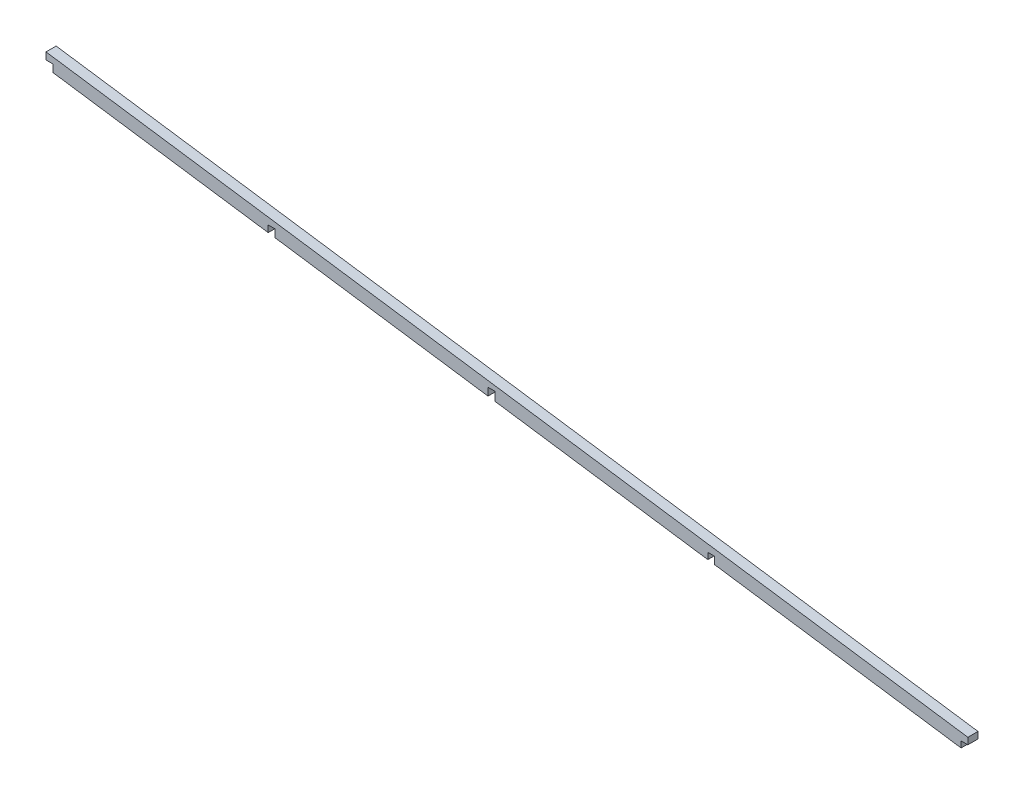
ISO-10303-21;
HEADER;
FILE_DESCRIPTION(('STEP AP214'),'2;1');
FILE_NAME('part.step','',(''),(''),'','','');
FILE_SCHEMA(('AUTOMOTIVE_DESIGN { 1 0 10303 214 1 1 1 1 }'));
ENDSEC;
DATA;
#1=APPLICATION_CONTEXT('core data for automotive mechanical design processes');
#2=APPLICATION_PROTOCOL_DEFINITION('international standard','automotive_design',2000,#1);
#3=PRODUCT_CONTEXT('',#1,'mechanical');
#4=PRODUCT('Part','Part','',(#3));
#5=PRODUCT_RELATED_PRODUCT_CATEGORY('part','',(#4));
#6=PRODUCT_DEFINITION_FORMATION('','',#4);
#7=PRODUCT_DEFINITION_CONTEXT('part definition',#1,'design');
#8=PRODUCT_DEFINITION('design','',#6,#7);
#9=PRODUCT_DEFINITION_SHAPE('','',#8);
#10=(LENGTH_UNIT() NAMED_UNIT(*) SI_UNIT(.MILLI.,.METRE.));
#11=(NAMED_UNIT(*) PLANE_ANGLE_UNIT() SI_UNIT($,.RADIAN.));
#12=(NAMED_UNIT(*) SI_UNIT($,.STERADIAN.) SOLID_ANGLE_UNIT());
#13=UNCERTAINTY_MEASURE_WITH_UNIT(LENGTH_MEASURE(1.E-05),#10,'distance_accuracy_value','');
#14=(GEOMETRIC_REPRESENTATION_CONTEXT(3) GLOBAL_UNCERTAINTY_ASSIGNED_CONTEXT((#13)) GLOBAL_UNIT_ASSIGNED_CONTEXT((#10,
#11,#12)) REPRESENTATION_CONTEXT('',''));
#15=CARTESIAN_POINT('',(0.,0.,0.));
#16=DIRECTION('',(0.,0.,1.));
#17=DIRECTION('',(1.,0.,0.));
#18=AXIS2_PLACEMENT_3D('',#15,#16,#17);
#19=CARTESIAN_POINT('',(23.0418348757126,10.8574587561782,3.));
#20=DIRECTION('',(0.999999999980888,6.18255264759213E-06,0.));
#21=DIRECTION('',(-6.18255264759213E-06,0.999999999980888,0.));
#22=AXIS2_PLACEMENT_3D('',#19,#20,#21);
#23=PLANE('',#22);
#24=DIRECTION('',(6.18255264759213E-06,-0.999999999980888,0.));
#25=VECTOR('',#24,1.);
#26=CARTESIAN_POINT('',(23.0418348757126,10.8574587561782,0.));
#27=LINE('',#26,#25);
#28=CARTESIAN_POINT('',(23.0418213046744,13.052512948605,0.));
#29=VERTEX_POINT('',#28);
#30=CARTESIAN_POINT('',(23.0418348757126,10.8574587561782,0.));
#31=VERTEX_POINT('',#30);
#32=EDGE_CURVE('E201',#29,#31,#27,.T.);
#33=ORIENTED_EDGE('',*,*,#32,.T.);
#34=DIRECTION('',(0.,0.,-1.));
#35=VECTOR('',#34,1.);
#36=CARTESIAN_POINT('',(23.0418348757126,10.8574587561782,3.));
#37=LINE('',#36,#35);
#38=CARTESIAN_POINT('',(23.0418348757126,10.8574587561782,3.));
#39=VERTEX_POINT('',#38);
#40=EDGE_CURVE('E11',#39,#31,#37,.T.);
#41=ORIENTED_EDGE('',*,*,#40,.F.);
#42=DIRECTION('',(6.18255264759213E-06,-0.999999999980888,0.));
#43=VECTOR('',#42,1.);
#44=CARTESIAN_POINT('',(23.0418348757126,10.8574587561782,3.));
#45=LINE('',#44,#43);
#46=CARTESIAN_POINT('',(23.0418213046744,13.052512948605,3.));
#47=VERTEX_POINT('',#46);
#48=EDGE_CURVE('E240',#47,#39,#45,.T.);
#49=ORIENTED_EDGE('',*,*,#48,.F.);
#50=DIRECTION('',(0.,0.,-1.));
#51=VECTOR('',#50,1.);
#52=CARTESIAN_POINT('',(23.0418213046744,13.052512948605,3.));
#53=LINE('',#52,#51);
#54=EDGE_CURVE('E197',#47,#29,#53,.T.);
#55=ORIENTED_EDGE('',*,*,#54,.T.);
#56=EDGE_LOOP('',(#33,#41,#49,#55));
#57=FACE_BOUND('',#56,.T.);
#58=ADVANCED_FACE('F33',(#57),#23,.F.);
#59=CARTESIAN_POINT('',(23.0418348757126,10.8574587561782,3.));
#60=DIRECTION('',(0.142626079954699,0.989776642135364,0.));
#61=DIRECTION('',(-0.989776642135364,0.142626079954699,0.));
#62=AXIS2_PLACEMENT_3D('',#59,#60,#61);
#63=PLANE('',#62);
#64=DIRECTION('',(0.989776642135364,-0.142626079954699,0.));
#65=VECTOR('',#64,1.);
#66=CARTESIAN_POINT('',(23.0418348757126,10.8574587561782,0.));
#67=LINE('',#66,#65);
#68=CARTESIAN_POINT('',(86.7418100605947,1.6783395821486,0.));
#69=VERTEX_POINT('',#68);
#70=EDGE_CURVE('E204',#31,#69,#67,.T.);
#71=ORIENTED_EDGE('',*,*,#70,.T.);
#72=DIRECTION('',(0.,0.,-1.));
#73=VECTOR('',#72,1.);
#74=CARTESIAN_POINT('',(86.7418100605947,1.6783395821486,3.));
#75=LINE('',#74,#73);
#76=CARTESIAN_POINT('',(86.7418100605947,1.6783395821486,3.));
#77=VERTEX_POINT('',#76);
#78=EDGE_CURVE('E41',#77,#69,#75,.T.);
#79=ORIENTED_EDGE('',*,*,#78,.F.);
#80=DIRECTION('',(0.989776642135364,-0.142626079954699,0.));
#81=VECTOR('',#80,1.);
#82=CARTESIAN_POINT('',(23.0418348757126,10.8574587561782,3.));
#83=LINE('',#82,#81);
#84=EDGE_CURVE('E128',#39,#77,#83,.T.);
#85=ORIENTED_EDGE('',*,*,#84,.F.);
#86=ORIENTED_EDGE('',*,*,#40,.T.);
#87=EDGE_LOOP('',(#71,#79,#85,#86));
#88=FACE_BOUND('',#87,.T.);
#89=ADVANCED_FACE('F358',(#88),#63,.F.);
#90=CARTESIAN_POINT('',(86.7418100605947,1.6783395821486,3.));
#91=DIRECTION('',(-1.,-1.26523713879882E-13,0.));
#92=DIRECTION('',(1.26523713879882E-13,-1.,0.));
#93=AXIS2_PLACEMENT_3D('',#90,#91,#92);
#94=PLANE('',#93);
#95=DIRECTION('',(-1.26523713879882E-13,1.,0.));
#96=VECTOR('',#95,1.);
#97=CARTESIAN_POINT('',(86.7418100605947,1.6783395821486,0.));
#98=LINE('',#97,#96);
#99=CARTESIAN_POINT('',(86.7418100605944,3.65267445488095,0.));
#100=VERTEX_POINT('',#99);
#101=EDGE_CURVE('E206',#69,#100,#98,.T.);
#102=ORIENTED_EDGE('',*,*,#101,.T.);
#103=DIRECTION('',(0.,0.,-1.));
#104=VECTOR('',#103,1.);
#105=CARTESIAN_POINT('',(86.7418100605944,3.65267445488095,3.));
#106=LINE('',#105,#104);
#107=CARTESIAN_POINT('',(86.7418100605944,3.65267445488095,3.));
#108=VERTEX_POINT('',#107);
#109=EDGE_CURVE('E283',#108,#100,#106,.T.);
#110=ORIENTED_EDGE('',*,*,#109,.F.);
#111=DIRECTION('',(-1.26523713879882E-13,1.,0.));
#112=VECTOR('',#111,1.);
#113=CARTESIAN_POINT('',(86.7418100605947,1.6783395821486,3.));
#114=LINE('',#113,#112);
#115=EDGE_CURVE('E291',#77,#108,#114,.T.);
#116=ORIENTED_EDGE('',*,*,#115,.F.);
#117=ORIENTED_EDGE('',*,*,#78,.T.);
#118=EDGE_LOOP('',(#102,#110,#116,#117));
#119=FACE_BOUND('',#118,.T.);
#120=ADVANCED_FACE('F289',(#119),#94,.F.);
#121=CARTESIAN_POINT('',(86.7418100605944,3.65267445488095,3.));
#122=DIRECTION('',(0.,1.,0.));
#123=DIRECTION('',(-1.,0.,0.));
#124=AXIS2_PLACEMENT_3D('',#121,#122,#123);
#125=PLANE('',#124);
#126=DIRECTION('',(1.,0.,0.));
#127=VECTOR('',#126,1.);
#128=CARTESIAN_POINT('',(86.7418100605944,3.65267445488095,0.));
#129=LINE('',#128,#127);
#130=CARTESIAN_POINT('',(88.741809775464,3.65267445488107,0.));
#131=VERTEX_POINT('',#130);
#132=EDGE_CURVE('E208',#100,#131,#129,.T.);
#133=ORIENTED_EDGE('',*,*,#132,.T.);
#134=DIRECTION('',(0.,0.,-1.));
#135=VECTOR('',#134,1.);
#136=CARTESIAN_POINT('',(88.741809775464,3.65267445488107,3.));
#137=LINE('',#136,#135);
#138=CARTESIAN_POINT('',(88.741809775464,3.65267445488107,3.));
#139=VERTEX_POINT('',#138);
#140=EDGE_CURVE('E280',#139,#131,#137,.T.);
#141=ORIENTED_EDGE('',*,*,#140,.F.);
#142=DIRECTION('',(1.,0.,0.));
#143=VECTOR('',#142,1.);
#144=CARTESIAN_POINT('',(86.7418100605944,3.65267445488095,3.));
#145=LINE('',#144,#143);
#146=EDGE_CURVE('E309',#108,#139,#145,.T.);
#147=ORIENTED_EDGE('',*,*,#146,.F.);
#148=ORIENTED_EDGE('',*,*,#109,.T.);
#149=EDGE_LOOP('',(#133,#141,#147,#148));
#150=FACE_BOUND('',#149,.T.);
#151=ADVANCED_FACE('F300',(#150),#125,.F.);
#152=CARTESIAN_POINT('',(88.741809775464,3.65267445488107,3.));
#153=DIRECTION('',(1.,0.,0.));
#154=DIRECTION('',(0.,1.,0.));
#155=AXIS2_PLACEMENT_3D('',#152,#153,#154);
#156=PLANE('',#155);
#157=DIRECTION('',(0.,-1.,0.));
#158=VECTOR('',#157,1.);
#159=CARTESIAN_POINT('',(88.741809775464,3.65267445488107,0.));
#160=LINE('',#159,#158);
#161=CARTESIAN_POINT('',(88.7418097754637,1.3901729309594,0.));
#162=VERTEX_POINT('',#161);
#163=EDGE_CURVE('E210',#131,#162,#160,.T.);
#164=ORIENTED_EDGE('',*,*,#163,.T.);
#165=DIRECTION('',(0.,0.,-1.));
#166=VECTOR('',#165,1.);
#167=CARTESIAN_POINT('',(88.7418097754637,1.3901729309594,3.));
#168=LINE('',#167,#166);
#169=CARTESIAN_POINT('',(88.7418097754637,1.3901729309594,3.));
#170=VERTEX_POINT('',#169);
#171=EDGE_CURVE('E277',#170,#162,#168,.T.);
#172=ORIENTED_EDGE('',*,*,#171,.F.);
#173=DIRECTION('',(0.,-1.,0.));
#174=VECTOR('',#173,1.);
#175=CARTESIAN_POINT('',(88.741809775464,3.65267445488107,3.));
#176=LINE('',#175,#174);
#177=EDGE_CURVE('E306',#139,#170,#176,.T.);
#178=ORIENTED_EDGE('',*,*,#177,.F.);
#179=ORIENTED_EDGE('',*,*,#140,.T.);
#180=EDGE_LOOP('',(#164,#172,#178,#179));
#181=FACE_BOUND('',#180,.T.);
#182=ADVANCED_FACE('F304',(#181),#156,.F.);
#183=CARTESIAN_POINT('',(88.7418097754637,1.3901729309594,3.));
#184=DIRECTION('',(0.142606134063426,0.989779516118355,0.));
#185=DIRECTION('',(-0.989779516118355,0.142606134063426,0.));
#186=AXIS2_PLACEMENT_3D('',#183,#184,#185);
#187=PLANE('',#186);
#188=DIRECTION('',(0.989779516118355,-0.142606134063426,0.));
#189=VECTOR('',#188,1.);
#190=CARTESIAN_POINT('',(88.7418097754637,1.3901729309594,0.));
#191=LINE('',#190,#189);
#192=CARTESIAN_POINT('',(151.741786892209,-7.68678111425753,0.));
#193=VERTEX_POINT('',#192);
#194=EDGE_CURVE('E212',#162,#193,#191,.T.);
#195=ORIENTED_EDGE('',*,*,#194,.T.);
#196=DIRECTION('',(0.,0.,-1.));
#197=VECTOR('',#196,1.);
#198=CARTESIAN_POINT('',(151.741786892209,-7.68678111425753,3.));
#199=LINE('',#198,#197);
#200=CARTESIAN_POINT('',(151.741786892209,-7.68678111425753,3.));
#201=VERTEX_POINT('',#200);
#202=EDGE_CURVE('E274',#201,#193,#199,.T.);
#203=ORIENTED_EDGE('',*,*,#202,.F.);
#204=DIRECTION('',(0.989779516118355,-0.142606134063426,0.));
#205=VECTOR('',#204,1.);
#206=CARTESIAN_POINT('',(88.7418097754637,1.3901729309594,3.));
#207=LINE('',#206,#205);
#208=EDGE_CURVE('E308',#170,#201,#207,.T.);
#209=ORIENTED_EDGE('',*,*,#208,.F.);
#210=ORIENTED_EDGE('',*,*,#171,.T.);
#211=EDGE_LOOP('',(#195,#203,#209,#210));
#212=FACE_BOUND('',#211,.T.);
#213=ADVANCED_FACE('F371',(#212),#187,.F.);
#214=CARTESIAN_POINT('',(151.741786892209,-7.68678111425753,3.));
#215=DIRECTION('',(-1.,0.,0.));
#216=DIRECTION('',(0.,-1.,0.));
#217=AXIS2_PLACEMENT_3D('',#214,#215,#216);
#218=PLANE('',#217);
#219=DIRECTION('',(0.,1.,0.));
#220=VECTOR('',#219,1.);
#221=CARTESIAN_POINT('',(151.741786892209,-7.68678111425753,0.));
#222=LINE('',#221,#220);
#223=CARTESIAN_POINT('',(151.741786892209,-5.41532554511885,0.));
#224=VERTEX_POINT('',#223);
#225=EDGE_CURVE('E214',#193,#224,#222,.T.);
#226=ORIENTED_EDGE('',*,*,#225,.T.);
#227=DIRECTION('',(0.,0.,-1.));
#228=VECTOR('',#227,1.);
#229=CARTESIAN_POINT('',(151.741786892209,-5.41532554511885,3.));
#230=LINE('',#229,#228);
#231=CARTESIAN_POINT('',(151.741786892209,-5.41532554511885,3.));
#232=VERTEX_POINT('',#231);
#233=EDGE_CURVE('E271',#232,#224,#230,.T.);
#234=ORIENTED_EDGE('',*,*,#233,.F.);
#235=DIRECTION('',(0.,1.,0.));
#236=VECTOR('',#235,1.);
#237=CARTESIAN_POINT('',(151.741786892209,-7.68678111425753,3.));
#238=LINE('',#237,#236);
#239=EDGE_CURVE('E311',#201,#232,#238,.T.);
#240=ORIENTED_EDGE('',*,*,#239,.F.);
#241=ORIENTED_EDGE('',*,*,#202,.T.);
#242=EDGE_LOOP('',(#226,#234,#240,#241));
#243=FACE_BOUND('',#242,.T.);
#244=ADVANCED_FACE('F374',(#243),#218,.F.);
#245=CARTESIAN_POINT('',(151.741786892209,-5.41532554511885,3.));
#246=DIRECTION('',(0.,1.,0.));
#247=DIRECTION('',(-1.,0.,0.));
#248=AXIS2_PLACEMENT_3D('',#245,#246,#247);
#249=PLANE('',#248);
#250=DIRECTION('',(1.,0.,0.));
#251=VECTOR('',#250,1.);
#252=CARTESIAN_POINT('',(151.741786892209,-5.41532554511885,0.));
#253=LINE('',#252,#251);
#254=CARTESIAN_POINT('',(153.741786607054,-5.41532554511891,0.));
#255=VERTEX_POINT('',#254);
#256=EDGE_CURVE('E216',#224,#255,#253,.T.);
#257=ORIENTED_EDGE('',*,*,#256,.T.);
#258=DIRECTION('',(0.,0.,-1.));
#259=VECTOR('',#258,1.);
#260=CARTESIAN_POINT('',(153.741786607054,-5.41532554511891,3.));
#261=LINE('',#260,#259);
#262=CARTESIAN_POINT('',(153.741786607054,-5.41532554511891,3.));
#263=VERTEX_POINT('',#262);
#264=EDGE_CURVE('E268',#263,#255,#261,.T.);
#265=ORIENTED_EDGE('',*,*,#264,.F.);
#266=DIRECTION('',(1.,0.,0.));
#267=VECTOR('',#266,1.);
#268=CARTESIAN_POINT('',(151.741786892209,-5.41532554511885,3.));
#269=LINE('',#268,#267);
#270=EDGE_CURVE('E317',#232,#263,#269,.T.);
#271=ORIENTED_EDGE('',*,*,#270,.F.);
#272=ORIENTED_EDGE('',*,*,#233,.T.);
#273=EDGE_LOOP('',(#257,#265,#271,#272));
#274=FACE_BOUND('',#273,.T.);
#275=ADVANCED_FACE('F378',(#274),#249,.F.);
#276=CARTESIAN_POINT('',(153.741786607054,-5.41532554511891,3.));
#277=DIRECTION('',(1.,0.,0.));
#278=DIRECTION('',(0.,1.,0.));
#279=AXIS2_PLACEMENT_3D('',#276,#277,#278);
#280=PLANE('',#279);
#281=DIRECTION('',(0.,-1.,0.));
#282=VECTOR('',#281,1.);
#283=CARTESIAN_POINT('',(153.741786607054,-5.41532554511891,0.));
#284=LINE('',#283,#282);
#285=CARTESIAN_POINT('',(153.741786607054,-7.97494014156868,0.));
#286=VERTEX_POINT('',#285);
#287=EDGE_CURVE('E218',#255,#286,#284,.T.);
#288=ORIENTED_EDGE('',*,*,#287,.T.);
#289=DIRECTION('',(0.,0.,-1.));
#290=VECTOR('',#289,1.);
#291=CARTESIAN_POINT('',(153.741786607054,-7.97494014156868,3.));
#292=LINE('',#291,#290);
#293=CARTESIAN_POINT('',(153.741786607054,-7.97494014156868,3.));
#294=VERTEX_POINT('',#293);
#295=EDGE_CURVE('E265',#294,#286,#292,.T.);
#296=ORIENTED_EDGE('',*,*,#295,.F.);
#297=DIRECTION('',(0.,-1.,0.));
#298=VECTOR('',#297,1.);
#299=CARTESIAN_POINT('',(153.741786607054,-5.41532554511891,3.));
#300=LINE('',#299,#298);
#301=EDGE_CURVE('E319',#263,#294,#300,.T.);
#302=ORIENTED_EDGE('',*,*,#301,.F.);
#303=ORIENTED_EDGE('',*,*,#264,.T.);
#304=EDGE_LOOP('',(#288,#296,#302,#303));
#305=FACE_BOUND('',#304,.T.);
#306=ADVANCED_FACE('F382',(#305),#280,.F.);
#307=CARTESIAN_POINT('',(153.741786607054,-7.97494014156868,3.));
#308=DIRECTION('',(0.14260917570359,0.98977907787806,0.));
#309=DIRECTION('',(-0.98977907787806,0.14260917570359,0.));
#310=AXIS2_PLACEMENT_3D('',#307,#308,#309);
#311=PLANE('',#310);
#312=DIRECTION('',(0.98977907787806,-0.14260917570359,0.));
#313=VECTOR('',#312,1.);
#314=CARTESIAN_POINT('',(153.741786607054,-7.97494014156868,0.));
#315=LINE('',#314,#313);
#316=CARTESIAN_POINT('',(216.741763723401,-17.052091807745,0.));
#317=VERTEX_POINT('',#316);
#318=EDGE_CURVE('E220',#286,#317,#315,.T.);
#319=ORIENTED_EDGE('',*,*,#318,.T.);
#320=DIRECTION('',(0.,0.,-1.));
#321=VECTOR('',#320,1.);
#322=CARTESIAN_POINT('',(216.741763723401,-17.052091807745,3.));
#323=LINE('',#322,#321);
#324=CARTESIAN_POINT('',(216.741763723401,-17.052091807745,3.));
#325=VERTEX_POINT('',#324);
#326=EDGE_CURVE('E262',#325,#317,#323,.T.);
#327=ORIENTED_EDGE('',*,*,#326,.F.);
#328=DIRECTION('',(0.98977907787806,-0.14260917570359,0.));
#329=VECTOR('',#328,1.);
#330=CARTESIAN_POINT('',(153.741786607054,-7.97494014156868,3.));
#331=LINE('',#330,#329);
#332=EDGE_CURVE('E321',#294,#325,#331,.T.);
#333=ORIENTED_EDGE('',*,*,#332,.F.);
#334=ORIENTED_EDGE('',*,*,#295,.T.);
#335=EDGE_LOOP('',(#319,#327,#333,#334));
#336=FACE_BOUND('',#335,.T.);
#337=ADVANCED_FACE('F386',(#336),#311,.F.);
#338=CARTESIAN_POINT('',(216.741763723401,-17.052091807745,3.));
#339=DIRECTION('',(-1.,-3.72105289707384E-13,0.));
#340=DIRECTION('',(3.72105289707384E-13,-1.,0.));
#341=AXIS2_PLACEMENT_3D('',#338,#339,#340);
#342=PLANE('',#341);
#343=DIRECTION('',(-3.72105289707384E-13,1.,0.));
#344=VECTOR('',#343,1.);
#345=CARTESIAN_POINT('',(216.741763723401,-17.052091807745,0.));
#346=LINE('',#345,#344);
#347=CARTESIAN_POINT('',(216.7417637234,-15.1873255451197,0.));
#348=VERTEX_POINT('',#347);
#349=EDGE_CURVE('E222',#317,#348,#346,.T.);
#350=ORIENTED_EDGE('',*,*,#349,.T.);
#351=DIRECTION('',(0.,0.,-1.));
#352=VECTOR('',#351,1.);
#353=CARTESIAN_POINT('',(216.7417637234,-15.1873255451197,3.));
#354=LINE('',#353,#352);
#355=CARTESIAN_POINT('',(216.7417637234,-15.1873255451197,3.));
#356=VERTEX_POINT('',#355);
#357=EDGE_CURVE('E259',#356,#348,#354,.T.);
#358=ORIENTED_EDGE('',*,*,#357,.F.);
#359=DIRECTION('',(-3.72105289707384E-13,1.,0.));
#360=VECTOR('',#359,1.);
#361=CARTESIAN_POINT('',(216.741763723401,-17.052091807745,3.));
#362=LINE('',#361,#360);
#363=EDGE_CURVE('E323',#325,#356,#362,.T.);
#364=ORIENTED_EDGE('',*,*,#363,.F.);
#365=ORIENTED_EDGE('',*,*,#326,.T.);
#366=EDGE_LOOP('',(#350,#358,#364,#365));
#367=FACE_BOUND('',#366,.T.);
#368=ADVANCED_FACE('F390',(#367),#342,.F.);
#369=CARTESIAN_POINT('',(216.7417637234,-15.1873255451197,3.));
#370=DIRECTION('',(0.,1.,0.));
#371=DIRECTION('',(-1.,0.,0.));
#372=AXIS2_PLACEMENT_3D('',#369,#370,#371);
#373=PLANE('',#372);
#374=DIRECTION('',(1.,0.,0.));
#375=VECTOR('',#374,1.);
#376=CARTESIAN_POINT('',(216.7417637234,-15.1873255451197,0.));
#377=LINE('',#376,#375);
#378=CARTESIAN_POINT('',(218.741763438243,-15.1873255451198,0.));
#379=VERTEX_POINT('',#378);
#380=EDGE_CURVE('E224',#348,#379,#377,.T.);
#381=ORIENTED_EDGE('',*,*,#380,.T.);
#382=DIRECTION('',(0.,0.,-1.));
#383=VECTOR('',#382,1.);
#384=CARTESIAN_POINT('',(218.741763438243,-15.1873255451198,3.));
#385=LINE('',#384,#383);
#386=CARTESIAN_POINT('',(218.741763438243,-15.1873255451198,3.));
#387=VERTEX_POINT('',#386);
#388=EDGE_CURVE('E256',#387,#379,#385,.T.);
#389=ORIENTED_EDGE('',*,*,#388,.F.);
#390=DIRECTION('',(1.,0.,0.));
#391=VECTOR('',#390,1.);
#392=CARTESIAN_POINT('',(216.7417637234,-15.1873255451197,3.));
#393=LINE('',#392,#391);
#394=EDGE_CURVE('E325',#356,#387,#393,.T.);
#395=ORIENTED_EDGE('',*,*,#394,.F.);
#396=ORIENTED_EDGE('',*,*,#357,.T.);
#397=EDGE_LOOP('',(#381,#389,#395,#396));
#398=FACE_BOUND('',#397,.T.);
#399=ADVANCED_FACE('F394',(#398),#373,.F.);
#400=CARTESIAN_POINT('',(218.741763438243,-15.1873255451198,3.));
#401=DIRECTION('',(1.,1.9338002589399E-13,0.));
#402=DIRECTION('',(-1.9338002589399E-13,1.,0.));
#403=AXIS2_PLACEMENT_3D('',#400,#401,#402);
#404=PLANE('',#403);
#405=DIRECTION('',(1.9338002589399E-13,-1.,0.));
#406=VECTOR('',#405,1.);
#407=CARTESIAN_POINT('',(218.741763438243,-15.1873255451198,0.));
#408=LINE('',#407,#406);
#409=CARTESIAN_POINT('',(218.741763438243,-17.3402554162879,0.));
#410=VERTEX_POINT('',#409);
#411=EDGE_CURVE('E226',#379,#410,#408,.T.);
#412=ORIENTED_EDGE('',*,*,#411,.T.);
#413=DIRECTION('',(0.,0.,-1.));
#414=VECTOR('',#413,1.);
#415=CARTESIAN_POINT('',(218.741763438243,-17.3402554162879,3.));
#416=LINE('',#415,#414);
#417=CARTESIAN_POINT('',(218.741763438243,-17.3402554162879,3.));
#418=VERTEX_POINT('',#417);
#419=EDGE_CURVE('E253',#418,#410,#416,.T.);
#420=ORIENTED_EDGE('',*,*,#419,.F.);
#421=DIRECTION('',(1.9338002589399E-13,-1.,0.));
#422=VECTOR('',#421,1.);
#423=CARTESIAN_POINT('',(218.741763438243,-15.1873255451198,3.));
#424=LINE('',#423,#422);
#425=EDGE_CURVE('E327',#387,#418,#424,.T.);
#426=ORIENTED_EDGE('',*,*,#425,.F.);
#427=ORIENTED_EDGE('',*,*,#388,.T.);
#428=EDGE_LOOP('',(#412,#420,#426,#427));
#429=FACE_BOUND('',#428,.T.);
#430=ADVANCED_FACE('F398',(#429),#404,.F.);
#431=CARTESIAN_POINT('',(281.741740554579,-26.4174070824626,3.));
#432=DIRECTION('',(0.142609175703616,0.989779077878056,0.));
#433=DIRECTION('',(-0.989779077878056,0.142609175703616,0.));
#434=AXIS2_PLACEMENT_3D('',#431,#432,#433);
#435=PLANE('',#434);
#436=DIRECTION('',(0.989779077878056,-0.142609175703616,0.));
#437=VECTOR('',#436,1.);
#438=CARTESIAN_POINT('',(281.741740554579,-26.4174070824626,0.));
#439=LINE('',#438,#437);
#440=CARTESIAN_POINT('',(291.638157863248,-27.8433009474187,0.));
#441=VERTEX_POINT('',#440);
#442=EDGE_CURVE('E229',#410,#441,#439,.T.);
#443=ORIENTED_EDGE('',*,*,#442,.T.);
#444=DIRECTION('',(0.,0.,-1.));
#445=VECTOR('',#444,1.);
#446=CARTESIAN_POINT('',(291.638157863248,-27.8433009474187,3.));
#447=LINE('',#446,#445);
#448=CARTESIAN_POINT('',(291.638157863248,-27.8433009474187,3.));
#449=VERTEX_POINT('',#448);
#450=EDGE_CURVE('E250',#449,#441,#447,.T.);
#451=ORIENTED_EDGE('',*,*,#450,.F.);
#452=DIRECTION('',(0.98977907787806,-0.142609175703591,0.));
#453=VECTOR('',#452,1.);
#454=CARTESIAN_POINT('',(218.741763438243,-17.3402554162879,3.));
#455=LINE('',#454,#453);
#456=EDGE_CURVE('E329',#418,#449,#455,.T.);
#457=ORIENTED_EDGE('',*,*,#456,.F.);
#458=ORIENTED_EDGE('',*,*,#419,.T.);
#459=EDGE_LOOP('',(#443,#451,#457,#458));
#460=FACE_BOUND('',#459,.T.);
#461=ADVANCED_FACE('F402',(#460),#435,.F.);
#462=CARTESIAN_POINT('',(291.638157863248,-27.8433009474187,3.));
#463=DIRECTION('',(-1.,-3.37336583461908E-13,0.));
#464=DIRECTION('',(3.37336583461908E-13,-1.,0.));
#465=AXIS2_PLACEMENT_3D('',#462,#463,#464);
#466=PLANE('',#465);
#467=DIRECTION('',(-3.37336583461908E-13,1.,0.));
#468=VECTOR('',#467,1.);
#469=CARTESIAN_POINT('',(291.638157863248,-27.8433009474187,0.));
#470=LINE('',#469,#468);
#471=CARTESIAN_POINT('',(291.638157863247,-26.0331721517887,0.));
#472=VERTEX_POINT('',#471);
#473=EDGE_CURVE('E231',#441,#472,#470,.T.);
#474=ORIENTED_EDGE('',*,*,#473,.T.);
#475=DIRECTION('',(0.,0.,-1.));
#476=VECTOR('',#475,1.);
#477=CARTESIAN_POINT('',(291.638157863247,-26.0331721517887,3.));
#478=LINE('',#477,#476);
#479=CARTESIAN_POINT('',(291.638157863247,-26.0331721517887,3.));
#480=VERTEX_POINT('',#479);
#481=EDGE_CURVE('E247',#480,#472,#478,.T.);
#482=ORIENTED_EDGE('',*,*,#481,.F.);
#483=DIRECTION('',(-3.37336583461908E-13,1.,0.));
#484=VECTOR('',#483,1.);
#485=CARTESIAN_POINT('',(291.638157863248,-27.8433009474187,3.));
#486=LINE('',#485,#484);
#487=EDGE_CURVE('E331',#449,#480,#486,.T.);
#488=ORIENTED_EDGE('',*,*,#487,.F.);
#489=ORIENTED_EDGE('',*,*,#450,.T.);
#490=EDGE_LOOP('',(#474,#482,#488,#489));
#491=FACE_BOUND('',#490,.T.);
#492=ADVANCED_FACE('F406',(#491),#466,.F.);
#493=CARTESIAN_POINT('',(291.638157863247,-26.0331721517887,3.));
#494=DIRECTION('',(0.,1.,0.));
#495=DIRECTION('',(-1.,0.,0.));
#496=AXIS2_PLACEMENT_3D('',#493,#494,#495);
#497=PLANE('',#496);
#498=DIRECTION('',(1.,0.,0.));
#499=VECTOR('',#498,1.);
#500=CARTESIAN_POINT('',(291.638157863247,-26.0331721517887,0.));
#501=LINE('',#500,#499);
#502=CARTESIAN_POINT('',(293.638157578099,-26.0331721517887,0.));
#503=VERTEX_POINT('',#502);
#504=EDGE_CURVE('E233',#472,#503,#501,.T.);
#505=ORIENTED_EDGE('',*,*,#504,.T.);
#506=DIRECTION('',(0.,0.,-1.));
#507=VECTOR('',#506,1.);
#508=CARTESIAN_POINT('',(293.638157578099,-26.0331721517887,3.));
#509=LINE('',#508,#507);
#510=CARTESIAN_POINT('',(293.638157578099,-26.0331721517887,3.));
#511=VERTEX_POINT('',#510);
#512=EDGE_CURVE('E244',#511,#503,#509,.T.);
#513=ORIENTED_EDGE('',*,*,#512,.F.);
#514=DIRECTION('',(1.,0.,0.));
#515=VECTOR('',#514,1.);
#516=CARTESIAN_POINT('',(291.638157863247,-26.0331721517887,3.));
#517=LINE('',#516,#515);
#518=EDGE_CURVE('E333',#480,#511,#517,.T.);
#519=ORIENTED_EDGE('',*,*,#518,.F.);
#520=ORIENTED_EDGE('',*,*,#481,.T.);
#521=EDGE_LOOP('',(#505,#513,#519,#520));
#522=FACE_BOUND('',#521,.T.);
#523=ADVANCED_FACE('F339',(#522),#497,.F.);
#524=CARTESIAN_POINT('',(293.638157578099,-24.101253339672,3.));
#525=DIRECTION('',(-1.,1.14934749603555E-13,0.));
#526=DIRECTION('',(-1.14934749603555E-13,-1.,0.));
#527=AXIS2_PLACEMENT_3D('',#524,#525,#526);
#528=PLANE('',#527);
#529=DIRECTION('',(1.14934749603555E-13,1.,0.));
#530=VECTOR('',#529,1.);
#531=CARTESIAN_POINT('',(293.638157578099,-24.101253339672,0.));
#532=LINE('',#531,#530);
#533=CARTESIAN_POINT('',(293.638157578099,-24.101253339672,0.));
#534=VERTEX_POINT('',#533);
#535=EDGE_CURVE('E235',#503,#534,#532,.T.);
#536=ORIENTED_EDGE('',*,*,#535,.T.);
#537=DIRECTION('',(0.,0.,-1.));
#538=VECTOR('',#537,1.);
#539=CARTESIAN_POINT('',(293.638157578099,-24.101253339672,3.));
#540=LINE('',#539,#538);
#541=CARTESIAN_POINT('',(293.638157578099,-24.101253339672,3.));
#542=VERTEX_POINT('',#541);
#543=EDGE_CURVE('E192',#542,#534,#540,.T.);
#544=ORIENTED_EDGE('',*,*,#543,.F.);
#545=DIRECTION('',(1.14934749603555E-13,1.,0.));
#546=VECTOR('',#545,1.);
#547=CARTESIAN_POINT('',(293.638157578099,-24.101253339672,3.));
#548=LINE('',#547,#546);
#549=EDGE_CURVE('E183',#511,#542,#548,.T.);
#550=ORIENTED_EDGE('',*,*,#549,.F.);
#551=ORIENTED_EDGE('',*,*,#512,.T.);
#552=EDGE_LOOP('',(#536,#544,#550,#551));
#553=FACE_BOUND('',#552,.T.);
#554=ADVANCED_FACE('F343',(#553),#528,.F.);
#555=CARTESIAN_POINT('',(21.0418348757124,15.1212147777336,3.));
#556=DIRECTION('',(-0.142418125360364,-0.989806585939314,0.));
#557=DIRECTION('',(0.989806585939314,-0.142418125360364,0.));
#558=AXIS2_PLACEMENT_3D('',#555,#556,#557);
#559=PLANE('',#558);
#560=DIRECTION('',(-0.989806585939313,0.142418125360364,0.));
#561=VECTOR('',#560,1.);
#562=CARTESIAN_POINT('',(21.0418348757124,15.1212147777336,0.));
#563=LINE('',#562,#561);
#564=CARTESIAN_POINT('',(21.0418348757124,15.1212147777336,0.));
#565=VERTEX_POINT('',#564);
#566=EDGE_CURVE('E191',#534,#565,#563,.T.);
#567=ORIENTED_EDGE('',*,*,#566,.T.);
#568=DIRECTION('',(0.,0.,-1.));
#569=VECTOR('',#568,1.);
#570=CARTESIAN_POINT('',(21.0418348757124,15.1212147777336,3.));
#571=LINE('',#570,#569);
#572=CARTESIAN_POINT('',(21.0418348757124,15.1212147777336,3.));
#573=VERTEX_POINT('',#572);
#574=EDGE_CURVE('E188',#573,#565,#571,.T.);
#575=ORIENTED_EDGE('',*,*,#574,.F.);
#576=DIRECTION('',(-0.989806585939313,0.142418125360364,0.));
#577=VECTOR('',#576,1.);
#578=CARTESIAN_POINT('',(21.0418348757124,15.1212147777336,3.));
#579=LINE('',#578,#577);
#580=EDGE_CURVE('E177',#542,#573,#579,.T.);
#581=ORIENTED_EDGE('',*,*,#580,.F.);
#582=ORIENTED_EDGE('',*,*,#543,.T.);
#583=EDGE_LOOP('',(#567,#575,#581,#582));
#584=FACE_BOUND('',#583,.T.);
#585=ADVANCED_FACE('F189',(#584),#559,.F.);
#586=CARTESIAN_POINT('',(21.0418348757123,13.0525129486049,3.));
#587=DIRECTION('',(1.,0.,0.));
#588=DIRECTION('',(0.,1.,0.));
#589=AXIS2_PLACEMENT_3D('',#586,#587,#588);
#590=PLANE('',#589);
#591=DIRECTION('',(0.,-1.,0.));
#592=VECTOR('',#591,1.);
#593=CARTESIAN_POINT('',(21.0418348757123,13.0525129486049,0.));
#594=LINE('',#593,#592);
#595=CARTESIAN_POINT('',(21.0418348757123,13.0525129486049,0.));
#596=VERTEX_POINT('',#595);
#597=EDGE_CURVE('E114',#565,#596,#594,.T.);
#598=ORIENTED_EDGE('',*,*,#597,.T.);
#599=DIRECTION('',(0.,0.,-1.));
#600=VECTOR('',#599,1.);
#601=CARTESIAN_POINT('',(21.0418348757123,13.0525129486049,3.));
#602=LINE('',#601,#600);
#603=CARTESIAN_POINT('',(21.0418348757123,13.0525129486049,3.));
#604=VERTEX_POINT('',#603);
#605=EDGE_CURVE('E193',#604,#596,#602,.T.);
#606=ORIENTED_EDGE('',*,*,#605,.F.);
#607=DIRECTION('',(0.,-1.,0.));
#608=VECTOR('',#607,1.);
#609=CARTESIAN_POINT('',(21.0418348757123,13.0525129486049,3.));
#610=LINE('',#609,#608);
#611=EDGE_CURVE('E181',#573,#604,#610,.T.);
#612=ORIENTED_EDGE('',*,*,#611,.F.);
#613=ORIENTED_EDGE('',*,*,#574,.T.);
#614=EDGE_LOOP('',(#598,#606,#612,#613));
#615=FACE_BOUND('',#614,.T.);
#616=ADVANCED_FACE('F195',(#615),#590,.F.);
#617=CARTESIAN_POINT('',(23.0418213046744,13.052512948605,3.));
#618=DIRECTION('',(0.,1.,0.));
#619=DIRECTION('',(-1.,0.,0.));
#620=AXIS2_PLACEMENT_3D('',#617,#618,#619);
#621=PLANE('',#620);
#622=DIRECTION('',(1.,0.,0.));
#623=VECTOR('',#622,1.);
#624=CARTESIAN_POINT('',(23.0418213046744,13.052512948605,0.));
#625=LINE('',#624,#623);
#626=EDGE_CURVE('E120',#596,#29,#625,.T.);
#627=ORIENTED_EDGE('',*,*,#626,.T.);
#628=ORIENTED_EDGE('',*,*,#54,.F.);
#629=DIRECTION('',(1.,0.,0.));
#630=VECTOR('',#629,1.);
#631=CARTESIAN_POINT('',(23.0418213046744,13.052512948605,3.));
#632=LINE('',#631,#630);
#633=EDGE_CURVE('E49',#604,#47,#632,.T.);
#634=ORIENTED_EDGE('',*,*,#633,.F.);
#635=ORIENTED_EDGE('',*,*,#605,.T.);
#636=EDGE_LOOP('',(#627,#628,#634,#635));
#637=FACE_BOUND('',#636,.T.);
#638=ADVANCED_FACE('F347',(#637),#621,.F.);
#639=CARTESIAN_POINT('',(0.,0.,3.));
#640=DIRECTION('',(0.,0.,1.));
#641=DIRECTION('',(1.,0.,0.));
#642=AXIS2_PLACEMENT_3D('',#639,#640,#641);
#643=PLANE('',#642);
#644=ORIENTED_EDGE('',*,*,#48,.T.);
#645=ORIENTED_EDGE('',*,*,#84,.T.);
#646=ORIENTED_EDGE('',*,*,#115,.T.);
#647=ORIENTED_EDGE('',*,*,#146,.T.);
#648=ORIENTED_EDGE('',*,*,#177,.T.);
#649=ORIENTED_EDGE('',*,*,#208,.T.);
#650=ORIENTED_EDGE('',*,*,#239,.T.);
#651=ORIENTED_EDGE('',*,*,#270,.T.);
#652=ORIENTED_EDGE('',*,*,#301,.T.);
#653=ORIENTED_EDGE('',*,*,#332,.T.);
#654=ORIENTED_EDGE('',*,*,#363,.T.);
#655=ORIENTED_EDGE('',*,*,#394,.T.);
#656=ORIENTED_EDGE('',*,*,#425,.T.);
#657=ORIENTED_EDGE('',*,*,#456,.T.);
#658=ORIENTED_EDGE('',*,*,#487,.T.);
#659=ORIENTED_EDGE('',*,*,#518,.T.);
#660=ORIENTED_EDGE('',*,*,#549,.T.);
#661=ORIENTED_EDGE('',*,*,#580,.T.);
#662=ORIENTED_EDGE('',*,*,#611,.T.);
#663=ORIENTED_EDGE('',*,*,#633,.T.);
#664=EDGE_LOOP('',(#644,#645,#646,#647,#648,#649,#650,#651,#652,#653,#654,#655,#656,#657,#658,
#659,#660,#661,#662,#663));
#665=FACE_BOUND('',#664,.T.);
#666=ADVANCED_FACE('F179',(#665),#643,.T.);
#667=CARTESIAN_POINT('',(0.,0.,0.));
#668=DIRECTION('',(0.,0.,1.));
#669=DIRECTION('',(1.,0.,0.));
#670=AXIS2_PLACEMENT_3D('',#667,#668,#669);
#671=PLANE('',#670);
#672=ORIENTED_EDGE('',*,*,#32,.F.);
#673=ORIENTED_EDGE('',*,*,#626,.F.);
#674=ORIENTED_EDGE('',*,*,#597,.F.);
#675=ORIENTED_EDGE('',*,*,#566,.F.);
#676=ORIENTED_EDGE('',*,*,#535,.F.);
#677=ORIENTED_EDGE('',*,*,#504,.F.);
#678=ORIENTED_EDGE('',*,*,#473,.F.);
#679=ORIENTED_EDGE('',*,*,#442,.F.);
#680=ORIENTED_EDGE('',*,*,#411,.F.);
#681=ORIENTED_EDGE('',*,*,#380,.F.);
#682=ORIENTED_EDGE('',*,*,#349,.F.);
#683=ORIENTED_EDGE('',*,*,#318,.F.);
#684=ORIENTED_EDGE('',*,*,#287,.F.);
#685=ORIENTED_EDGE('',*,*,#256,.F.);
#686=ORIENTED_EDGE('',*,*,#225,.F.);
#687=ORIENTED_EDGE('',*,*,#194,.F.);
#688=ORIENTED_EDGE('',*,*,#163,.F.);
#689=ORIENTED_EDGE('',*,*,#132,.F.);
#690=ORIENTED_EDGE('',*,*,#101,.F.);
#691=ORIENTED_EDGE('',*,*,#70,.F.);
#692=EDGE_LOOP('',(#672,#673,#674,#675,#676,#677,#678,#679,#680,#681,#682,#683,#684,#685,#686,
#687,#688,#689,#690,#691));
#693=FACE_BOUND('',#692,.T.);
#694=ADVANCED_FACE('F295',(#693),#671,.F.);
#695=CLOSED_SHELL('',(#58,#89,#120,#151,#182,#213,#244,#275,#306,#337,#368,#399,#430,#461,#492,
#523,#554,#585,#616,#638,#666,#694));
#696=MANIFOLD_SOLID_BREP('B2',#695);
#697=ADVANCED_BREP_SHAPE_REPRESENTATION('',(#18,#696),#14);
#698=SHAPE_DEFINITION_REPRESENTATION(#9,#697);
ENDSEC;
END-ISO-10303-21;
